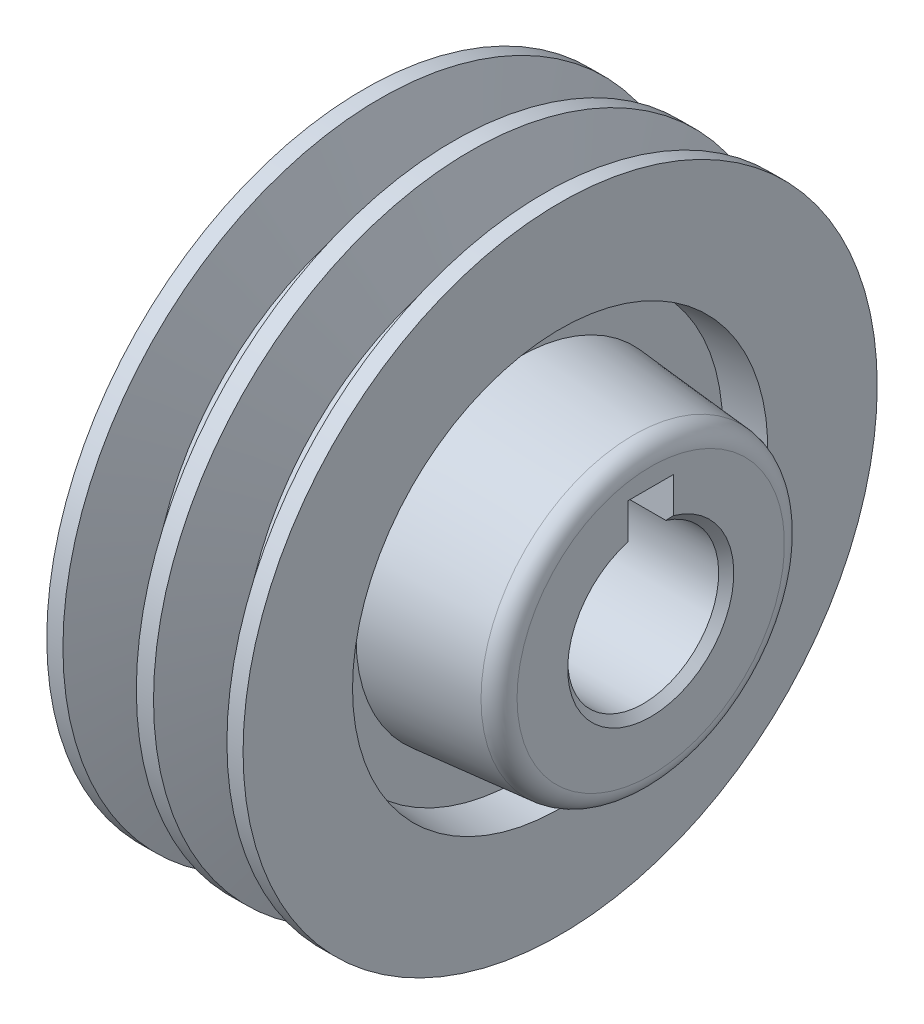
ISO-10303-21;
HEADER;
FILE_DESCRIPTION(('STEP AP214'),'2;1');
FILE_NAME('part.step','',(''),(''),'','','');
FILE_SCHEMA(('AUTOMOTIVE_DESIGN { 1 0 10303 214 1 1 1 1 }'));
ENDSEC;
DATA;
#1=APPLICATION_CONTEXT('core data for automotive mechanical design processes');
#2=APPLICATION_PROTOCOL_DEFINITION('international standard','automotive_design',2000,#1);
#3=PRODUCT_CONTEXT('',#1,'mechanical');
#4=PRODUCT('Part','Part','',(#3));
#5=PRODUCT_RELATED_PRODUCT_CATEGORY('part','',(#4));
#6=PRODUCT_DEFINITION_FORMATION('','',#4);
#7=PRODUCT_DEFINITION_CONTEXT('part definition',#1,'design');
#8=PRODUCT_DEFINITION('design','',#6,#7);
#9=PRODUCT_DEFINITION_SHAPE('','',#8);
#10=(LENGTH_UNIT() NAMED_UNIT(*) SI_UNIT(.MILLI.,.METRE.));
#11=(NAMED_UNIT(*) PLANE_ANGLE_UNIT() SI_UNIT($,.RADIAN.));
#12=(NAMED_UNIT(*) SI_UNIT($,.STERADIAN.) SOLID_ANGLE_UNIT());
#13=UNCERTAINTY_MEASURE_WITH_UNIT(LENGTH_MEASURE(1.E-05),#10,'distance_accuracy_value','');
#14=(GEOMETRIC_REPRESENTATION_CONTEXT(3) GLOBAL_UNCERTAINTY_ASSIGNED_CONTEXT((#13)) GLOBAL_UNIT_ASSIGNED_CONTEXT((#10,
#11,#12)) REPRESENTATION_CONTEXT('',''));
#15=CARTESIAN_POINT('',(0.,0.,0.));
#16=DIRECTION('',(0.,0.,1.));
#17=DIRECTION('',(1.,0.,0.));
#18=AXIS2_PLACEMENT_3D('',#15,#16,#17);
#19=CARTESIAN_POINT('',(0.,0.,0.));
#20=DIRECTION('',(-1.,0.,0.));
#21=DIRECTION('',(0.,0.,1.));
#22=AXIS2_PLACEMENT_3D('',#19,#20,#21);
#23=CYLINDRICAL_SURFACE('',#22,42.);
#24=CARTESIAN_POINT('',(26.,0.,0.));
#25=DIRECTION('',(-1.,0.,0.));
#26=DIRECTION('',(0.,0.,1.));
#27=AXIS2_PLACEMENT_3D('',#24,#25,#26);
#28=CIRCLE('',#27,42.);
#29=CARTESIAN_POINT('',(26.,0.,42.));
#30=VERTEX_POINT('',#29);
#31=EDGE_CURVE('E255',#30,#30,#28,.T.);
#32=ORIENTED_EDGE('',*,*,#31,.T.);
#33=EDGE_LOOP('',(#32));
#34=FACE_BOUND('',#33,.T.);
#35=CARTESIAN_POINT('',(23.8614613629173,0.,0.));
#36=DIRECTION('',(-1.,0.,0.));
#37=DIRECTION('',(0.,0.,1.));
#38=AXIS2_PLACEMENT_3D('',#35,#36,#37);
#39=CIRCLE('',#38,42.);
#40=CARTESIAN_POINT('',(23.8614613629173,0.,42.));
#41=VERTEX_POINT('',#40);
#42=EDGE_CURVE('E380',#41,#41,#39,.T.);
#43=ORIENTED_EDGE('',*,*,#42,.F.);
#44=EDGE_LOOP('',(#43));
#45=FACE_BOUND('',#44,.T.);
#46=ADVANCED_FACE('F43',(#34,#45),#23,.T.);
#47=CARTESIAN_POINT('',(11.8614613629173,0.,0.));
#48=DIRECTION('',(-1.,0.,0.));
#49=DIRECTION('',(0.,0.,1.));
#50=AXIS2_PLACEMENT_3D('',#47,#48,#49);
#51=CIRCLE('',#50,42.);
#52=CARTESIAN_POINT('',(11.8614613629173,0.,42.));
#53=VERTEX_POINT('',#52);
#54=EDGE_CURVE('E227',#53,#53,#51,.T.);
#55=ORIENTED_EDGE('',*,*,#54,.F.);
#56=EDGE_LOOP('',(#55));
#57=FACE_BOUND('',#56,.T.);
#58=CARTESIAN_POINT('',(14.1385386370827,0.,0.));
#59=DIRECTION('',(-1.,0.,0.));
#60=DIRECTION('',(0.,0.,1.));
#61=AXIS2_PLACEMENT_3D('',#58,#59,#60);
#62=CIRCLE('',#61,42.);
#63=CARTESIAN_POINT('',(14.1385386370827,0.,42.));
#64=VERTEX_POINT('',#63);
#65=EDGE_CURVE('E377',#64,#64,#62,.T.);
#66=ORIENTED_EDGE('',*,*,#65,.T.);
#67=EDGE_LOOP('',(#66));
#68=FACE_BOUND('',#67,.T.);
#69=ADVANCED_FACE('F198',(#57,#68),#23,.T.);
#70=CARTESIAN_POINT('',(0.,0.,0.));
#71=DIRECTION('',(-1.,0.,0.));
#72=DIRECTION('',(0.,0.,1.));
#73=AXIS2_PLACEMENT_3D('',#70,#71,#72);
#74=CIRCLE('',#73,42.);
#75=CARTESIAN_POINT('',(0.,0.,42.));
#76=VERTEX_POINT('',#75);
#77=EDGE_CURVE('E221',#76,#76,#74,.T.);
#78=ORIENTED_EDGE('',*,*,#77,.F.);
#79=EDGE_LOOP('',(#78));
#80=FACE_BOUND('',#79,.T.);
#81=CARTESIAN_POINT('',(2.13853863708269,0.,0.));
#82=DIRECTION('',(-1.,0.,0.));
#83=DIRECTION('',(0.,0.,1.));
#84=AXIS2_PLACEMENT_3D('',#81,#82,#83);
#85=CIRCLE('',#84,42.);
#86=CARTESIAN_POINT('',(2.13853863708269,0.,42.));
#87=VERTEX_POINT('',#86);
#88=EDGE_CURVE('E224',#87,#87,#85,.T.);
#89=ORIENTED_EDGE('',*,*,#88,.T.);
#90=EDGE_LOOP('',(#89));
#91=FACE_BOUND('',#90,.T.);
#92=ADVANCED_FACE('F201',(#80,#91),#23,.T.);
#93=CARTESIAN_POINT('',(0.,0.,0.));
#94=DIRECTION('',(-1.,0.,0.));
#95=DIRECTION('',(0.,0.,1.));
#96=AXIS2_PLACEMENT_3D('',#93,#94,#95);
#97=CYLINDRICAL_SURFACE('',#96,9.99999999999999);
#98=CARTESIAN_POINT('',(-11.,0.,0.));
#99=DIRECTION('',(1.,0.,0.));
#100=DIRECTION('',(0.,0.,-1.));
#101=AXIS2_PLACEMENT_3D('',#98,#99,#100);
#102=CIRCLE('',#101,9.99999999999999);
#103=CARTESIAN_POINT('',(-11.,9.53939201416945,-3.));
#104=VERTEX_POINT('',#103);
#105=CARTESIAN_POINT('',(-11.,9.53939201416945,3.));
#106=VERTEX_POINT('',#105);
#107=EDGE_CURVE('E276',#104,#106,#102,.F.);
#108=ORIENTED_EDGE('',*,*,#107,.T.);
#109=DIRECTION('',(-1.,0.,0.));
#110=VECTOR('',#109,1.);
#111=CARTESIAN_POINT('',(38.,9.53939201416945,3.));
#112=LINE('',#111,#110);
#113=CARTESIAN_POINT('',(37.,9.53939201416945,3.));
#114=VERTEX_POINT('',#113);
#115=EDGE_CURVE('E105',#114,#106,#112,.T.);
#116=ORIENTED_EDGE('',*,*,#115,.F.);
#117=CARTESIAN_POINT('',(37.,0.,0.));
#118=DIRECTION('',(-1.,0.,0.));
#119=DIRECTION('',(0.,0.,1.));
#120=AXIS2_PLACEMENT_3D('',#117,#118,#119);
#121=CIRCLE('',#120,9.99999999999999);
#122=CARTESIAN_POINT('',(37.,9.53939201416945,-3.));
#123=VERTEX_POINT('',#122);
#124=EDGE_CURVE('E272',#114,#123,#121,.F.);
#125=ORIENTED_EDGE('',*,*,#124,.T.);
#126=DIRECTION('',(-1.,0.,0.));
#127=VECTOR('',#126,1.);
#128=CARTESIAN_POINT('',(38.,9.53939201416945,-3.));
#129=LINE('',#128,#127);
#130=EDGE_CURVE('E114',#123,#104,#129,.T.);
#131=ORIENTED_EDGE('',*,*,#130,.T.);
#132=EDGE_LOOP('',(#108,#116,#125,#131));
#133=FACE_BOUND('',#132,.T.);
#134=ADVANCED_FACE('F211',(#133),#97,.F.);
#135=CARTESIAN_POINT('',(-12.,9.99999999999999,0.));
#136=DIRECTION('',(1.,0.,0.));
#137=DIRECTION('',(0.,0.,-1.));
#138=AXIS2_PLACEMENT_3D('',#135,#136,#137);
#139=PLANE('',#138);
#140=CARTESIAN_POINT('',(-12.,0.,0.));
#141=DIRECTION('',(1.,0.,0.));
#142=DIRECTION('',(0.,0.,-1.));
#143=AXIS2_PLACEMENT_3D('',#140,#141,#142);
#144=CIRCLE('',#143,17.7091720649564);
#145=CARTESIAN_POINT('',(-12.,0.,-17.7091720649564));
#146=VERTEX_POINT('',#145);
#147=EDGE_CURVE('E52',#146,#146,#144,.F.);
#148=ORIENTED_EDGE('',*,*,#147,.T.);
#149=EDGE_LOOP('',(#148));
#150=FACE_BOUND('',#149,.T.);
#151=CARTESIAN_POINT('',(-12.,0.,0.));
#152=DIRECTION('',(1.,0.,0.));
#153=DIRECTION('',(0.,0.,-1.));
#154=AXIS2_PLACEMENT_3D('',#151,#152,#153);
#155=CIRCLE('',#154,11.);
#156=CARTESIAN_POINT('',(-12.,10.5830052442584,3.));
#157=VERTEX_POINT('',#156);
#158=CARTESIAN_POINT('',(-12.,10.5830052442584,-3.));
#159=VERTEX_POINT('',#158);
#160=EDGE_CURVE('E279',#157,#159,#155,.T.);
#161=ORIENTED_EDGE('',*,*,#160,.T.);
#162=DIRECTION('',(0.,-1.,0.));
#163=VECTOR('',#162,1.);
#164=CARTESIAN_POINT('',(-12.,9.53939201416945,-3.));
#165=LINE('',#164,#163);
#166=CARTESIAN_POINT('',(-12.,15.299999952316,-3.));
#167=VERTEX_POINT('',#166);
#168=EDGE_CURVE('E67',#167,#159,#165,.T.);
#169=ORIENTED_EDGE('',*,*,#168,.F.);
#170=DIRECTION('',(0.,0.,-1.));
#171=VECTOR('',#170,1.);
#172=CARTESIAN_POINT('',(-12.,15.299999952316,-3.));
#173=LINE('',#172,#171);
#174=CARTESIAN_POINT('',(-12.,15.299999952316,3.));
#175=VERTEX_POINT('',#174);
#176=EDGE_CURVE('E124',#175,#167,#173,.T.);
#177=ORIENTED_EDGE('',*,*,#176,.F.);
#178=DIRECTION('',(0.,1.,0.));
#179=VECTOR('',#178,1.);
#180=CARTESIAN_POINT('',(-12.,9.53939201416945,3.));
#181=LINE('',#180,#179);
#182=EDGE_CURVE('E99',#157,#175,#181,.T.);
#183=ORIENTED_EDGE('',*,*,#182,.F.);
#184=EDGE_LOOP('',(#161,#169,#177,#183));
#185=FACE_BOUND('',#184,.T.);
#186=ADVANCED_FACE('F216',(#150,#185),#139,.F.);
#187=CARTESIAN_POINT('',(5.5,0.,0.));
#188=DIRECTION('',(1.,0.,0.));
#189=DIRECTION('',(0.,0.,-1.));
#190=AXIS2_PLACEMENT_3D('',#187,#188,#189);
#191=CONICAL_SURFACE('',#190,21.5310516117034,0.0872664625997026);
#192=CARTESIAN_POINT('',(-9.7178893568691,0.,0.));
#193=DIRECTION('',(-1.,0.,0.));
#194=DIRECTION('',(0.,0.,1.));
#195=AXIS2_PLACEMENT_3D('',#192,#193,#194);
#196=CIRCLE('',#195,20.1996588101858);
#197=CARTESIAN_POINT('',(-9.7178893568691,0.,20.1996588101858));
#198=VERTEX_POINT('',#197);
#199=EDGE_CURVE('E11',#198,#198,#196,.F.);
#200=ORIENTED_EDGE('',*,*,#199,.T.);
#201=EDGE_LOOP('',(#200));
#202=FACE_BOUND('',#201,.T.);
#203=CARTESIAN_POINT('',(5.5,0.,0.));
#204=DIRECTION('',(-1.,0.,0.));
#205=DIRECTION('',(0.,0.,1.));
#206=AXIS2_PLACEMENT_3D('',#203,#204,#205);
#207=CIRCLE('',#206,21.5310516117034);
#208=CARTESIAN_POINT('',(5.5,0.,21.5310516117034));
#209=VERTEX_POINT('',#208);
#210=EDGE_CURVE('E268',#209,#209,#207,.T.);
#211=ORIENTED_EDGE('',*,*,#210,.T.);
#212=EDGE_LOOP('',(#211));
#213=FACE_BOUND('',#212,.T.);
#214=ADVANCED_FACE('F299',(#202,#213),#191,.T.);
#215=CARTESIAN_POINT('',(5.5,21.5310516117034,0.));
#216=DIRECTION('',(1.,0.,0.));
#217=DIRECTION('',(0.,0.,-1.));
#218=AXIS2_PLACEMENT_3D('',#215,#216,#217);
#219=PLANE('',#218);
#220=ORIENTED_EDGE('',*,*,#210,.F.);
#221=EDGE_LOOP('',(#220));
#222=FACE_BOUND('',#221,.T.);
#223=CARTESIAN_POINT('',(5.5,0.,0.));
#224=DIRECTION('',(-1.,0.,0.));
#225=DIRECTION('',(0.,0.,1.));
#226=AXIS2_PLACEMENT_3D('',#223,#224,#225);
#227=CIRCLE('',#226,27.0188123506074);
#228=CARTESIAN_POINT('',(5.5,0.,27.0188123506074));
#229=VERTEX_POINT('',#228);
#230=EDGE_CURVE('E264',#229,#229,#227,.T.);
#231=ORIENTED_EDGE('',*,*,#230,.T.);
#232=EDGE_LOOP('',(#231));
#233=FACE_BOUND('',#232,.T.);
#234=ADVANCED_FACE('F304',(#222,#233),#219,.F.);
#235=CARTESIAN_POINT('',(0.,0.,0.));
#236=DIRECTION('',(-1.,0.,0.));
#237=DIRECTION('',(0.,0.,1.));
#238=AXIS2_PLACEMENT_3D('',#235,#236,#237);
#239=CONICAL_SURFACE('',#238,27.5,0.0872664625997166);
#240=ORIENTED_EDGE('',*,*,#230,.F.);
#241=EDGE_LOOP('',(#240));
#242=FACE_BOUND('',#241,.T.);
#243=CARTESIAN_POINT('',(0.,0.,0.));
#244=DIRECTION('',(-1.,0.,0.));
#245=DIRECTION('',(0.,0.,1.));
#246=AXIS2_PLACEMENT_3D('',#243,#244,#245);
#247=CIRCLE('',#246,27.5);
#248=CARTESIAN_POINT('',(0.,0.,27.5));
#249=VERTEX_POINT('',#248);
#250=EDGE_CURVE('E260',#249,#249,#247,.T.);
#251=ORIENTED_EDGE('',*,*,#250,.T.);
#252=EDGE_LOOP('',(#251));
#253=FACE_BOUND('',#252,.T.);
#254=ADVANCED_FACE('F310',(#242,#253),#239,.F.);
#255=CARTESIAN_POINT('',(0.,27.5,0.));
#256=DIRECTION('',(1.,0.,0.));
#257=DIRECTION('',(0.,0.,-1.));
#258=AXIS2_PLACEMENT_3D('',#255,#256,#257);
#259=PLANE('',#258);
#260=ORIENTED_EDGE('',*,*,#250,.F.);
#261=EDGE_LOOP('',(#260));
#262=FACE_BOUND('',#261,.T.);
#263=ORIENTED_EDGE('',*,*,#77,.T.);
#264=EDGE_LOOP('',(#263));
#265=FACE_BOUND('',#264,.T.);
#266=ADVANCED_FACE('F313',(#262,#265),#259,.F.);
#267=CARTESIAN_POINT('',(26.,42.,0.));
#268=DIRECTION('',(-1.,0.,0.));
#269=DIRECTION('',(0.,0.,1.));
#270=AXIS2_PLACEMENT_3D('',#267,#268,#269);
#271=PLANE('',#270);
#272=ORIENTED_EDGE('',*,*,#31,.F.);
#273=EDGE_LOOP('',(#272));
#274=FACE_BOUND('',#273,.T.);
#275=CARTESIAN_POINT('',(26.,0.,0.));
#276=DIRECTION('',(-1.,0.,0.));
#277=DIRECTION('',(0.,0.,1.));
#278=AXIS2_PLACEMENT_3D('',#275,#276,#277);
#279=CIRCLE('',#278,27.5);
#280=CARTESIAN_POINT('',(26.,0.,27.5));
#281=VERTEX_POINT('',#280);
#282=EDGE_CURVE('E251',#281,#281,#279,.T.);
#283=ORIENTED_EDGE('',*,*,#282,.T.);
#284=EDGE_LOOP('',(#283));
#285=FACE_BOUND('',#284,.T.);
#286=ADVANCED_FACE('F316',(#274,#285),#271,.F.);
#287=CARTESIAN_POINT('',(20.5,0.,0.));
#288=DIRECTION('',(1.,0.,0.));
#289=DIRECTION('',(0.,0.,-1.));
#290=AXIS2_PLACEMENT_3D('',#287,#288,#289);
#291=CONICAL_SURFACE('',#290,27.0188123506075,0.0872664625997021);
#292=ORIENTED_EDGE('',*,*,#282,.F.);
#293=EDGE_LOOP('',(#292));
#294=FACE_BOUND('',#293,.T.);
#295=CARTESIAN_POINT('',(20.5,0.,0.));
#296=DIRECTION('',(-1.,0.,0.));
#297=DIRECTION('',(0.,0.,1.));
#298=AXIS2_PLACEMENT_3D('',#295,#296,#297);
#299=CIRCLE('',#298,27.0188123506075);
#300=CARTESIAN_POINT('',(20.5,0.,27.0188123506075));
#301=VERTEX_POINT('',#300);
#302=EDGE_CURVE('E247',#301,#301,#299,.T.);
#303=ORIENTED_EDGE('',*,*,#302,.T.);
#304=EDGE_LOOP('',(#303));
#305=FACE_BOUND('',#304,.T.);
#306=ADVANCED_FACE('F321',(#294,#305),#291,.F.);
#307=CARTESIAN_POINT('',(20.5,27.0188123506075,0.));
#308=DIRECTION('',(-1.,0.,0.));
#309=DIRECTION('',(0.,0.,1.));
#310=AXIS2_PLACEMENT_3D('',#307,#308,#309);
#311=PLANE('',#310);
#312=ORIENTED_EDGE('',*,*,#302,.F.);
#313=EDGE_LOOP('',(#312));
#314=FACE_BOUND('',#313,.T.);
#315=CARTESIAN_POINT('',(20.5,0.,0.));
#316=DIRECTION('',(-1.,0.,0.));
#317=DIRECTION('',(0.,0.,1.));
#318=AXIS2_PLACEMENT_3D('',#315,#316,#317);
#319=CIRCLE('',#318,21.5310516117037);
#320=CARTESIAN_POINT('',(20.5,0.,21.5310516117037));
#321=VERTEX_POINT('',#320);
#322=EDGE_CURVE('E243',#321,#321,#319,.T.);
#323=ORIENTED_EDGE('',*,*,#322,.T.);
#324=EDGE_LOOP('',(#323));
#325=FACE_BOUND('',#324,.T.);
#326=ADVANCED_FACE('F329',(#314,#325),#311,.F.);
#327=CARTESIAN_POINT('',(38.,0.,0.));
#328=DIRECTION('',(-1.,0.,0.));
#329=DIRECTION('',(0.,0.,1.));
#330=AXIS2_PLACEMENT_3D('',#327,#328,#329);
#331=CONICAL_SURFACE('',#330,20.,0.0872664625997164);
#332=CARTESIAN_POINT('',(35.7178893568692,0.,0.));
#333=DIRECTION('',(1.,0.,0.));
#334=DIRECTION('',(0.,0.,-1.));
#335=AXIS2_PLACEMENT_3D('',#332,#333,#334);
#336=CIRCLE('',#335,20.1996588101858);
#337=CARTESIAN_POINT('',(35.7178893568692,0.,-20.1996588101858));
#338=VERTEX_POINT('',#337);
#339=EDGE_CURVE('E287',#338,#338,#336,.F.);
#340=ORIENTED_EDGE('',*,*,#339,.T.);
#341=EDGE_LOOP('',(#340));
#342=FACE_BOUND('',#341,.T.);
#343=ORIENTED_EDGE('',*,*,#322,.F.);
#344=EDGE_LOOP('',(#343));
#345=FACE_BOUND('',#344,.T.);
#346=ADVANCED_FACE('F337',(#342,#345),#331,.T.);
#347=CARTESIAN_POINT('',(38.,20.,0.));
#348=DIRECTION('',(-1.,0.,0.));
#349=DIRECTION('',(0.,0.,1.));
#350=AXIS2_PLACEMENT_3D('',#347,#348,#349);
#351=PLANE('',#350);
#352=CARTESIAN_POINT('',(38.,0.,0.));
#353=DIRECTION('',(-1.,0.,0.));
#354=DIRECTION('',(0.,0.,1.));
#355=AXIS2_PLACEMENT_3D('',#352,#353,#354);
#356=CIRCLE('',#355,17.7091720649564);
#357=CARTESIAN_POINT('',(38.,0.,17.7091720649564));
#358=VERTEX_POINT('',#357);
#359=EDGE_CURVE('E290',#358,#358,#356,.F.);
#360=ORIENTED_EDGE('',*,*,#359,.T.);
#361=EDGE_LOOP('',(#360));
#362=FACE_BOUND('',#361,.T.);
#363=DIRECTION('',(0.,0.,-1.));
#364=VECTOR('',#363,1.);
#365=CARTESIAN_POINT('',(38.,15.299999952316,-3.));
#366=LINE('',#365,#364);
#367=CARTESIAN_POINT('',(38.,15.299999952316,3.));
#368=VERTEX_POINT('',#367);
#369=CARTESIAN_POINT('',(38.,15.299999952316,-3.));
#370=VERTEX_POINT('',#369);
#371=EDGE_CURVE('E108',#368,#370,#366,.T.);
#372=ORIENTED_EDGE('',*,*,#371,.T.);
#373=DIRECTION('',(0.,-1.,0.));
#374=VECTOR('',#373,1.);
#375=CARTESIAN_POINT('',(38.,9.53939201416945,-3.));
#376=LINE('',#375,#374);
#377=CARTESIAN_POINT('',(38.,10.5830052442583,-3.));
#378=VERTEX_POINT('',#377);
#379=EDGE_CURVE('E121',#370,#378,#376,.T.);
#380=ORIENTED_EDGE('',*,*,#379,.T.);
#381=CARTESIAN_POINT('',(38.,0.,0.));
#382=DIRECTION('',(-1.,0.,0.));
#383=DIRECTION('',(0.,0.,1.));
#384=AXIS2_PLACEMENT_3D('',#381,#382,#383);
#385=CIRCLE('',#384,11.);
#386=CARTESIAN_POINT('',(38.,10.5830052442583,3.));
#387=VERTEX_POINT('',#386);
#388=EDGE_CURVE('E119',#378,#387,#385,.T.);
#389=ORIENTED_EDGE('',*,*,#388,.T.);
#390=DIRECTION('',(0.,1.,0.));
#391=VECTOR('',#390,1.);
#392=CARTESIAN_POINT('',(38.,9.53939201416945,3.));
#393=LINE('',#392,#391);
#394=EDGE_CURVE('E59',#387,#368,#393,.T.);
#395=ORIENTED_EDGE('',*,*,#394,.T.);
#396=EDGE_LOOP('',(#372,#380,#389,#395));
#397=FACE_BOUND('',#396,.T.);
#398=ADVANCED_FACE('F117',(#362,#397),#351,.F.);
#399=CARTESIAN_POINT('',(0.,0.,0.));
#400=DIRECTION('',(-1.,0.,0.));
#401=DIRECTION('',(0.,0.,1.));
#402=AXIS2_PLACEMENT_3D('',#399,#400,#401);
#403=CYLINDRICAL_SURFACE('',#402,33.);
#404=CARTESIAN_POINT('',(9.10988522978941,0.,0.));
#405=DIRECTION('',(-1.,0.,0.));
#406=DIRECTION('',(0.,0.,1.));
#407=AXIS2_PLACEMENT_3D('',#404,#405,#406);
#408=CIRCLE('',#407,33.);
#409=CARTESIAN_POINT('',(9.10988522978941,0.,33.));
#410=VERTEX_POINT('',#409);
#411=EDGE_CURVE('E233',#410,#410,#408,.T.);
#412=ORIENTED_EDGE('',*,*,#411,.T.);
#413=EDGE_LOOP('',(#412));
#414=FACE_BOUND('',#413,.T.);
#415=CARTESIAN_POINT('',(4.8901147702106,0.,0.));
#416=DIRECTION('',(-1.,0.,0.));
#417=DIRECTION('',(0.,0.,1.));
#418=AXIS2_PLACEMENT_3D('',#415,#416,#417);
#419=CIRCLE('',#418,33.);
#420=CARTESIAN_POINT('',(4.8901147702106,0.,33.));
#421=VERTEX_POINT('',#420);
#422=EDGE_CURVE('E228',#421,#421,#419,.T.);
#423=ORIENTED_EDGE('',*,*,#422,.F.);
#424=EDGE_LOOP('',(#423));
#425=FACE_BOUND('',#424,.T.);
#426=ADVANCED_FACE('F344',(#414,#425),#403,.T.);
#427=CARTESIAN_POINT('',(9.10988522978941,0.,0.));
#428=DIRECTION('',(1.,0.,0.));
#429=DIRECTION('',(0.,0.,-1.));
#430=AXIS2_PLACEMENT_3D('',#427,#428,#429);
#431=CONICAL_SURFACE('',#430,33.,1.27409035395586);
#432=ORIENTED_EDGE('',*,*,#54,.T.);
#433=EDGE_LOOP('',(#432));
#434=FACE_BOUND('',#433,.T.);
#435=ORIENTED_EDGE('',*,*,#411,.F.);
#436=EDGE_LOOP('',(#435));
#437=FACE_BOUND('',#436,.T.);
#438=ADVANCED_FACE('F348',(#434,#437),#431,.T.);
#439=CARTESIAN_POINT('',(2.13853863708269,0.,0.));
#440=DIRECTION('',(-1.,0.,0.));
#441=DIRECTION('',(0.,0.,1.));
#442=AXIS2_PLACEMENT_3D('',#439,#440,#441);
#443=CONICAL_SURFACE('',#442,42.,1.27409035395586);
#444=ORIENTED_EDGE('',*,*,#422,.T.);
#445=EDGE_LOOP('',(#444));
#446=FACE_BOUND('',#445,.T.);
#447=ORIENTED_EDGE('',*,*,#88,.F.);
#448=EDGE_LOOP('',(#447));
#449=FACE_BOUND('',#448,.T.);
#450=ADVANCED_FACE('F352',(#446,#449),#443,.T.);
#451=CARTESIAN_POINT('',(12.,0.,0.));
#452=DIRECTION('',(-1.,0.,0.));
#453=DIRECTION('',(0.,0.,1.));
#454=AXIS2_PLACEMENT_3D('',#451,#452,#453);
#455=CYLINDRICAL_SURFACE('',#454,33.);
#456=CARTESIAN_POINT('',(21.1098852297894,0.,0.));
#457=DIRECTION('',(-1.,0.,0.));
#458=DIRECTION('',(0.,0.,1.));
#459=AXIS2_PLACEMENT_3D('',#456,#457,#458);
#460=CIRCLE('',#459,33.);
#461=CARTESIAN_POINT('',(21.1098852297894,0.,33.));
#462=VERTEX_POINT('',#461);
#463=EDGE_CURVE('E236',#462,#462,#460,.T.);
#464=ORIENTED_EDGE('',*,*,#463,.T.);
#465=EDGE_LOOP('',(#464));
#466=FACE_BOUND('',#465,.T.);
#467=CARTESIAN_POINT('',(16.8901147702106,0.,0.));
#468=DIRECTION('',(-1.,0.,0.));
#469=DIRECTION('',(0.,0.,1.));
#470=AXIS2_PLACEMENT_3D('',#467,#468,#469);
#471=CIRCLE('',#470,33.);
#472=CARTESIAN_POINT('',(16.8901147702106,0.,33.));
#473=VERTEX_POINT('',#472);
#474=EDGE_CURVE('E374',#473,#473,#471,.T.);
#475=ORIENTED_EDGE('',*,*,#474,.F.);
#476=EDGE_LOOP('',(#475));
#477=FACE_BOUND('',#476,.T.);
#478=ADVANCED_FACE('F356',(#466,#477),#455,.T.);
#479=CARTESIAN_POINT('',(21.1098852297894,0.,0.));
#480=DIRECTION('',(1.,0.,0.));
#481=DIRECTION('',(0.,0.,-1.));
#482=AXIS2_PLACEMENT_3D('',#479,#480,#481);
#483=CONICAL_SURFACE('',#482,33.,1.27409035395586);
#484=ORIENTED_EDGE('',*,*,#42,.T.);
#485=EDGE_LOOP('',(#484));
#486=FACE_BOUND('',#485,.T.);
#487=ORIENTED_EDGE('',*,*,#463,.F.);
#488=EDGE_LOOP('',(#487));
#489=FACE_BOUND('',#488,.T.);
#490=ADVANCED_FACE('F360',(#486,#489),#483,.T.);
#491=CARTESIAN_POINT('',(14.1385386370827,0.,0.));
#492=DIRECTION('',(-1.,0.,0.));
#493=DIRECTION('',(0.,0.,1.));
#494=AXIS2_PLACEMENT_3D('',#491,#492,#493);
#495=CONICAL_SURFACE('',#494,42.,1.27409035395586);
#496=ORIENTED_EDGE('',*,*,#474,.T.);
#497=EDGE_LOOP('',(#496));
#498=FACE_BOUND('',#497,.T.);
#499=ORIENTED_EDGE('',*,*,#65,.F.);
#500=EDGE_LOOP('',(#499));
#501=FACE_BOUND('',#500,.T.);
#502=ADVANCED_FACE('F363',(#498,#501),#495,.T.);
#503=CARTESIAN_POINT('',(-11.,0.,0.));
#504=DIRECTION('',(-1.,0.,0.));
#505=DIRECTION('',(0.,0.,1.));
#506=AXIS2_PLACEMENT_3D('',#503,#504,#505);
#507=CONICAL_SURFACE('',#506,9.99999999999999,0.785398163397455);
#508=CARTESIAN_POINT('',(-14.0010616306219,12.6502017186775,-3.));
#509=CARTESIAN_POINT('',(-13.8030033648418,12.4466487731703,-3.));
#510=CARTESIAN_POINT('',(-13.605074155322,12.2429703490018,-3.));
#511=CARTESIAN_POINT('',(-13.2095185963236,11.8353189056376,-3.));
#512=CARTESIAN_POINT('',(-13.0118922474144,11.6313458858895,-3.));
#513=CARTESIAN_POINT('',(-12.419546453618,11.0189317124651,-3.));
#514=CARTESIAN_POINT('',(-12.0253494984335,10.6099843925142,-3.));
#515=CARTESIAN_POINT('',(-11.4355108001854,9.99515885911993,-3.));
#516=CARTESIAN_POINT('',(-11.2391389179217,9.78998105776215,-3.));
#517=CARTESIAN_POINT('',(-10.8469833901662,9.37906454642821,-3.));
#518=CARTESIAN_POINT('',(-10.6511997436886,9.17332583739322,-3.));
#519=CARTESIAN_POINT('',(-10.2603357313829,8.76117092237417,-3.));
#520=CARTESIAN_POINT('',(-10.0652553837406,8.55475469913094,-3.));
#521=CARTESIAN_POINT('',(-9.67597549650588,8.14109128560568,-3.));
#522=CARTESIAN_POINT('',(-9.48177596213112,7.93384409041489,-3.));
#523=CARTESIAN_POINT('',(-9.28810422670046,7.72610326572522,-3.));
#524=B_SPLINE_CURVE_WITH_KNOTS('',3,(#508,#509,#510,#511,#512,#513,#514,#515,#516,#517,#518,
#519,#520,#521,#522,#523),.UNSPECIFIED.,.F.,.F.,(4,2,2,2,2,2,2,4),(0.,0.852025523285082,
1.70405264643827,3.40806061156886,4.2600800276897,5.11209801505469,5.96413787805248,
6.81618278169294),.UNSPECIFIED.);
#525=EDGE_CURVE('E149',#159,#104,#524,.T.);
#526=ORIENTED_EDGE('',*,*,#525,.F.);
#527=ORIENTED_EDGE('',*,*,#160,.F.);
#528=CARTESIAN_POINT('',(-9.28810422670046,7.72610326572522,3.));
#529=CARTESIAN_POINT('',(-9.48177596213112,7.93384409041489,3.));
#530=CARTESIAN_POINT('',(-9.67597549650588,8.14109128560568,3.));
#531=CARTESIAN_POINT('',(-10.0652553837406,8.55475469913094,3.));
#532=CARTESIAN_POINT('',(-10.2603357313829,8.76117092237417,3.));
#533=CARTESIAN_POINT('',(-10.6511997436886,9.17332583739322,3.));
#534=CARTESIAN_POINT('',(-10.8469833901662,9.37906454642821,3.));
#535=CARTESIAN_POINT('',(-11.2391389179217,9.78998105776215,3.));
#536=CARTESIAN_POINT('',(-11.4355108001854,9.99515885911993,3.));
#537=CARTESIAN_POINT('',(-12.0253494984335,10.6099843925142,3.));
#538=CARTESIAN_POINT('',(-12.419546453618,11.0189317124651,3.));
#539=CARTESIAN_POINT('',(-13.0118922474144,11.6313458858895,3.));
#540=CARTESIAN_POINT('',(-13.2095185963236,11.8353189056376,3.));
#541=CARTESIAN_POINT('',(-13.605074155322,12.2429703490018,3.));
#542=CARTESIAN_POINT('',(-13.8030033648418,12.4466487731703,3.));
#543=CARTESIAN_POINT('',(-14.0010616306219,12.6502017186775,3.));
#544=B_SPLINE_CURVE_WITH_KNOTS('',3,(#528,#529,#530,#531,#532,#533,#534,#535,#536,#537,#538,
#539,#540,#541,#542,#543),.UNSPECIFIED.,.F.,.F.,(4,2,2,2,2,2,2,4),(0.,0.852044903640454,
1.70408476663825,2.55610275400324,3.40812217012408,5.11213013525467,5.96415725840785,
6.81618278169294),.UNSPECIFIED.);
#545=EDGE_CURVE('E134',#106,#157,#544,.T.);
#546=ORIENTED_EDGE('',*,*,#545,.F.);
#547=ORIENTED_EDGE('',*,*,#107,.F.);
#548=EDGE_LOOP('',(#526,#527,#546,#547));
#549=FACE_BOUND('',#548,.T.);
#550=ADVANCED_FACE('F156',(#549),#507,.F.);
#551=CARTESIAN_POINT('',(38.,0.,0.));
#552=DIRECTION('',(1.,0.,0.));
#553=DIRECTION('',(0.,0.,-1.));
#554=AXIS2_PLACEMENT_3D('',#551,#552,#553);
#555=CONICAL_SURFACE('',#554,11.,0.785398163397441);
#556=CARTESIAN_POINT('',(34.8732473832478,7.27928735233184,-3.));
#557=CARTESIAN_POINT('',(35.0660716864807,7.48782105642136,-3.));
#558=CARTESIAN_POINT('',(35.2595187803121,7.69577664481241,-3.));
#559=CARTESIAN_POINT('',(35.6474436640861,8.11072135746676,-3.));
#560=CARTESIAN_POINT('',(35.8419214455091,8.31771048969209,-3.));
#561=CARTESIAN_POINT('',(36.2316894861697,8.73090857789431,-3.));
#562=CARTESIAN_POINT('',(36.4269797179952,8.93711755975227,-3.));
#563=CARTESIAN_POINT('',(36.8182345395691,9.3488954507339,-3.));
#564=CARTESIAN_POINT('',(37.0141991308994,9.55446435835374,-3.));
#565=CARTESIAN_POINT('',(37.6029128526146,10.1703680744198,-3.));
#566=CARTESIAN_POINT('',(37.9964915156567,10.5799100124604,-3.));
#567=CARTESIAN_POINT('',(38.5880371079314,11.1930987814205,-3.));
#568=CARTESIAN_POINT('',(38.7854187371931,11.3973112806608,-3.));
#569=CARTESIAN_POINT('',(39.1805196444048,11.805408441618,-3.));
#570=CARTESIAN_POINT('',(39.3782389215257,12.0092931041375,-3.));
#571=CARTESIAN_POINT('',(39.5761012127097,12.2130390039628,-3.));
#572=B_SPLINE_CURVE_WITH_KNOTS('',3,(#556,#557,#558,#559,#560,#561,#562,#563,#564,#565,#566,
#567,#568,#569,#570,#571),.UNSPECIFIED.,.F.,.F.,(4,2,2,2,2,2,2,4),(0.,0.852057183679752,
1.70410733536306,2.55612896841235,3.40815260171882,5.11215801736264,5.96419084298408,
6.81622157941967),.UNSPECIFIED.);
#573=EDGE_CURVE('E177',#123,#378,#572,.T.);
#574=ORIENTED_EDGE('',*,*,#573,.F.);
#575=ORIENTED_EDGE('',*,*,#124,.F.);
#576=CARTESIAN_POINT('',(39.5761012127097,12.2130390039628,3.));
#577=CARTESIAN_POINT('',(39.3782389215257,12.0092931041375,3.));
#578=CARTESIAN_POINT('',(39.1805196444048,11.805408441618,3.));
#579=CARTESIAN_POINT('',(38.7854187371932,11.3973112806608,3.));
#580=CARTESIAN_POINT('',(38.5880371079314,11.1930987814205,3.));
#581=CARTESIAN_POINT('',(37.9964915156567,10.5799100124604,3.));
#582=CARTESIAN_POINT('',(37.6029128526146,10.1703680744198,3.));
#583=CARTESIAN_POINT('',(37.0141991308994,9.55446435835374,3.));
#584=CARTESIAN_POINT('',(36.8182345395691,9.34889545073389,3.));
#585=CARTESIAN_POINT('',(36.4269797179952,8.93711755975227,3.));
#586=CARTESIAN_POINT('',(36.2316894861697,8.73090857789431,3.));
#587=CARTESIAN_POINT('',(35.8419214455091,8.31771048969209,3.));
#588=CARTESIAN_POINT('',(35.6474436640861,8.11072135746675,3.));
#589=CARTESIAN_POINT('',(35.2595187803121,7.6957766448124,3.));
#590=CARTESIAN_POINT('',(35.0660716864807,7.48782105642136,3.));
#591=CARTESIAN_POINT('',(34.8732473832478,7.27928735233184,3.));
#592=B_SPLINE_CURVE_WITH_KNOTS('',3,(#576,#577,#578,#579,#580,#581,#582,#583,#584,#585,#586,
#587,#588,#589,#590,#591),.UNSPECIFIED.,.F.,.F.,(4,2,2,2,2,2,2,4),(0.,0.852030736435586,
1.70406356205702,3.40806897770086,4.26009261100733,5.11211424405661,5.96416439573994,
6.81622157941967),.UNSPECIFIED.);
#593=EDGE_CURVE('E169',#387,#114,#592,.T.);
#594=ORIENTED_EDGE('',*,*,#593,.F.);
#595=ORIENTED_EDGE('',*,*,#388,.F.);
#596=EDGE_LOOP('',(#574,#575,#594,#595));
#597=FACE_BOUND('',#596,.T.);
#598=ADVANCED_FACE('F184',(#597),#555,.F.);
#599=CARTESIAN_POINT('',(38.,9.53939201416945,-3.));
#600=DIRECTION('',(0.,0.,-1.));
#601=DIRECTION('',(-1.,0.,0.));
#602=AXIS2_PLACEMENT_3D('',#599,#600,#601);
#603=PLANE('',#602);
#604=ORIENTED_EDGE('',*,*,#525,.T.);
#605=ORIENTED_EDGE('',*,*,#130,.F.);
#606=ORIENTED_EDGE('',*,*,#573,.T.);
#607=ORIENTED_EDGE('',*,*,#379,.F.);
#608=DIRECTION('',(-1.,0.,0.));
#609=VECTOR('',#608,1.);
#610=CARTESIAN_POINT('',(38.,15.299999952316,-3.));
#611=LINE('',#610,#609);
#612=EDGE_CURVE('E104',#370,#167,#611,.T.);
#613=ORIENTED_EDGE('',*,*,#612,.T.);
#614=ORIENTED_EDGE('',*,*,#168,.T.);
#615=EDGE_LOOP('',(#604,#605,#606,#607,#613,#614));
#616=FACE_BOUND('',#615,.T.);
#617=ADVANCED_FACE('F164',(#616),#603,.F.);
#618=CARTESIAN_POINT('',(38.,15.299999952316,-3.));
#619=DIRECTION('',(0.,1.,0.));
#620=DIRECTION('',(0.,0.,1.));
#621=AXIS2_PLACEMENT_3D('',#618,#619,#620);
#622=PLANE('',#621);
#623=ORIENTED_EDGE('',*,*,#176,.T.);
#624=ORIENTED_EDGE('',*,*,#612,.F.);
#625=ORIENTED_EDGE('',*,*,#371,.F.);
#626=DIRECTION('',(-1.,0.,0.));
#627=VECTOR('',#626,1.);
#628=CARTESIAN_POINT('',(38.,15.299999952316,3.));
#629=LINE('',#628,#627);
#630=EDGE_CURVE('E95',#368,#175,#629,.T.);
#631=ORIENTED_EDGE('',*,*,#630,.T.);
#632=EDGE_LOOP('',(#623,#624,#625,#631));
#633=FACE_BOUND('',#632,.T.);
#634=ADVANCED_FACE('F109',(#633),#622,.F.);
#635=CARTESIAN_POINT('',(38.,9.53939201416945,3.));
#636=DIRECTION('',(0.,0.,1.));
#637=DIRECTION('',(1.,0.,0.));
#638=AXIS2_PLACEMENT_3D('',#635,#636,#637);
#639=PLANE('',#638);
#640=ORIENTED_EDGE('',*,*,#545,.T.);
#641=ORIENTED_EDGE('',*,*,#182,.T.);
#642=ORIENTED_EDGE('',*,*,#630,.F.);
#643=ORIENTED_EDGE('',*,*,#394,.F.);
#644=ORIENTED_EDGE('',*,*,#593,.T.);
#645=ORIENTED_EDGE('',*,*,#115,.T.);
#646=EDGE_LOOP('',(#640,#641,#642,#643,#644,#645));
#647=FACE_BOUND('',#646,.T.);
#648=ADVANCED_FACE('F97',(#647),#639,.F.);
#649=CARTESIAN_POINT('',(35.5,0.,0.));
#650=DIRECTION('',(-1.,0.,0.));
#651=DIRECTION('',(0.,0.,1.));
#652=AXIS2_PLACEMENT_3D('',#649,#650,#651);
#653=TOROIDAL_SURFACE('',#652,17.7091720649564,2.5);
#654=ORIENTED_EDGE('',*,*,#359,.F.);
#655=EDGE_LOOP('',(#654));
#656=FACE_BOUND('',#655,.T.);
#657=ORIENTED_EDGE('',*,*,#339,.F.);
#658=EDGE_LOOP('',(#657));
#659=FACE_BOUND('',#658,.T.);
#660=ADVANCED_FACE('F163',(#656,#659),#653,.T.);
#661=CARTESIAN_POINT('',(-9.5,0.,0.));
#662=DIRECTION('',(1.,0.,0.));
#663=DIRECTION('',(0.,0.,-1.));
#664=AXIS2_PLACEMENT_3D('',#661,#662,#663);
#665=TOROIDAL_SURFACE('',#664,17.7091720649564,2.5);
#666=ORIENTED_EDGE('',*,*,#199,.F.);
#667=EDGE_LOOP('',(#666));
#668=FACE_BOUND('',#667,.T.);
#669=ORIENTED_EDGE('',*,*,#147,.F.);
#670=EDGE_LOOP('',(#669));
#671=FACE_BOUND('',#670,.T.);
#672=ADVANCED_FACE('F45',(#668,#671),#665,.T.);
#673=CLOSED_SHELL('',(#46,#69,#92,#134,#186,#214,#234,#254,#266,#286,#306,#326,#346,#398,#426,
#438,#450,#478,#490,#502,#550,#598,#617,#634,#648,#660,#672));
#674=MANIFOLD_SOLID_BREP('B2',#673);
#675=ADVANCED_BREP_SHAPE_REPRESENTATION('',(#18,#674),#14);
#676=SHAPE_DEFINITION_REPRESENTATION(#9,#675);
ENDSEC;
END-ISO-10303-21;
